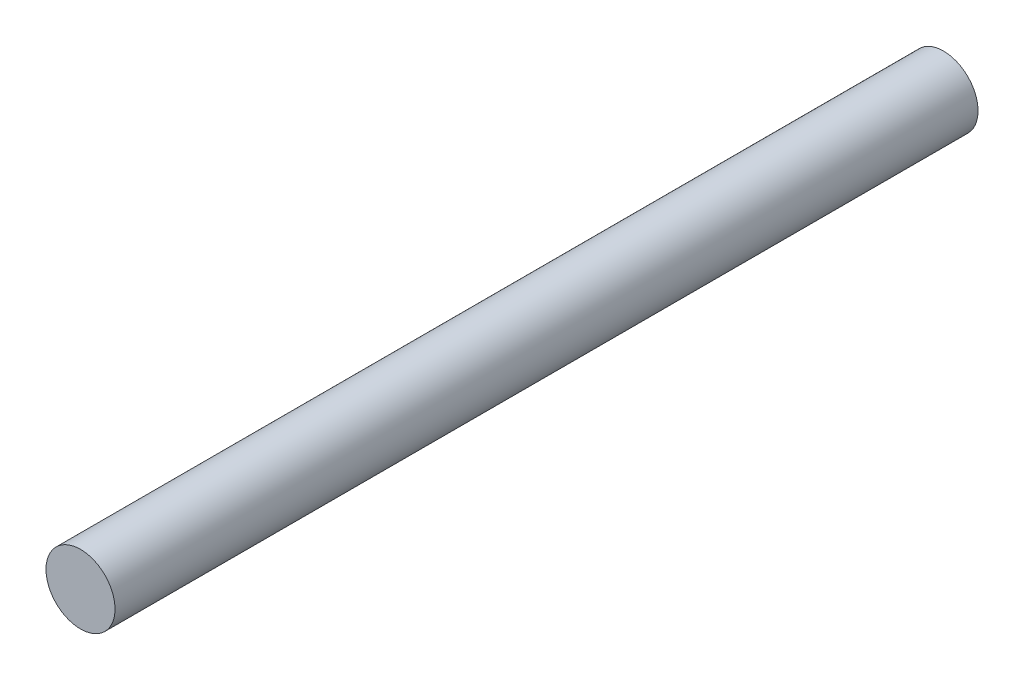
ISO-10303-21;
HEADER;
FILE_DESCRIPTION(('STEP AP214'),'2;1');
FILE_NAME('part.step','',(''),(''),'','','');
FILE_SCHEMA(('AUTOMOTIVE_DESIGN { 1 0 10303 214 1 1 1 1 }'));
ENDSEC;
DATA;
#1=APPLICATION_CONTEXT('core data for automotive mechanical design processes');
#2=APPLICATION_PROTOCOL_DEFINITION('international standard','automotive_design',2000,#1);
#3=PRODUCT_CONTEXT('',#1,'mechanical');
#4=PRODUCT('Part','Part','',(#3));
#5=PRODUCT_RELATED_PRODUCT_CATEGORY('part','',(#4));
#6=PRODUCT_DEFINITION_FORMATION('','',#4);
#7=PRODUCT_DEFINITION_CONTEXT('part definition',#1,'design');
#8=PRODUCT_DEFINITION('design','',#6,#7);
#9=PRODUCT_DEFINITION_SHAPE('','',#8);
#10=(LENGTH_UNIT() NAMED_UNIT(*) SI_UNIT(.MILLI.,.METRE.));
#11=(NAMED_UNIT(*) PLANE_ANGLE_UNIT() SI_UNIT($,.RADIAN.));
#12=(NAMED_UNIT(*) SI_UNIT($,.STERADIAN.) SOLID_ANGLE_UNIT());
#13=UNCERTAINTY_MEASURE_WITH_UNIT(LENGTH_MEASURE(1.E-05),#10,'distance_accuracy_value','');
#14=(GEOMETRIC_REPRESENTATION_CONTEXT(3) GLOBAL_UNCERTAINTY_ASSIGNED_CONTEXT((#13)) GLOBAL_UNIT_ASSIGNED_CONTEXT((#10,
#11,#12)) REPRESENTATION_CONTEXT('',''));
#15=CARTESIAN_POINT('',(0.,0.,0.));
#16=DIRECTION('',(0.,0.,1.));
#17=DIRECTION('',(1.,0.,0.));
#18=AXIS2_PLACEMENT_3D('',#15,#16,#17);
#19=CARTESIAN_POINT('',(0.,0.,50.));
#20=DIRECTION('',(0.,0.,-1.));
#21=DIRECTION('',(-1.,0.,0.));
#22=AXIS2_PLACEMENT_3D('',#19,#20,#21);
#23=CYLINDRICAL_SURFACE('',#22,4.);
#24=CARTESIAN_POINT('',(0.,0.,50.));
#25=DIRECTION('',(0.,0.,-1.));
#26=DIRECTION('',(-1.,0.,0.));
#27=AXIS2_PLACEMENT_3D('',#24,#25,#26);
#28=CIRCLE('',#27,4.);
#29=CARTESIAN_POINT('',(-3.99999999999999,0.,50.));
#30=VERTEX_POINT('',#29);
#31=EDGE_CURVE('E10',#30,#30,#28,.T.);
#32=ORIENTED_EDGE('',*,*,#31,.T.);
#33=EDGE_LOOP('',(#32));
#34=FACE_BOUND('',#33,.T.);
#35=CARTESIAN_POINT('',(0.,0.,-50.));
#36=DIRECTION('',(0.,0.,-1.));
#37=DIRECTION('',(-1.,0.,0.));
#38=AXIS2_PLACEMENT_3D('',#35,#36,#37);
#39=CIRCLE('',#38,4.);
#40=CARTESIAN_POINT('',(-3.99999999999999,0.,-50.));
#41=VERTEX_POINT('',#40);
#42=EDGE_CURVE('E36',#41,#41,#39,.T.);
#43=ORIENTED_EDGE('',*,*,#42,.F.);
#44=EDGE_LOOP('',(#43));
#45=FACE_BOUND('',#44,.T.);
#46=ADVANCED_FACE('F30',(#34,#45),#23,.T.);
#47=CARTESIAN_POINT('',(4.00000000000002,0.,50.));
#48=DIRECTION('',(0.,0.,1.));
#49=DIRECTION('',(1.,0.,0.));
#50=AXIS2_PLACEMENT_3D('',#47,#48,#49);
#51=PLANE('',#50);
#52=ORIENTED_EDGE('',*,*,#31,.F.);
#53=EDGE_LOOP('',(#52));
#54=FACE_BOUND('',#53,.T.);
#55=ADVANCED_FACE('F45',(#54),#51,.T.);
#56=CARTESIAN_POINT('',(0.,0.,-50.));
#57=DIRECTION('',(0.,0.,-1.));
#58=DIRECTION('',(-1.,0.,0.));
#59=AXIS2_PLACEMENT_3D('',#56,#57,#58);
#60=PLANE('',#59);
#61=ORIENTED_EDGE('',*,*,#42,.T.);
#62=EDGE_LOOP('',(#61));
#63=FACE_BOUND('',#62,.T.);
#64=ADVANCED_FACE('F42',(#63),#60,.T.);
#65=CLOSED_SHELL('',(#46,#55,#64));
#66=MANIFOLD_SOLID_BREP('B2',#65);
#67=ADVANCED_BREP_SHAPE_REPRESENTATION('',(#18,#66),#14);
#68=SHAPE_DEFINITION_REPRESENTATION(#9,#67);
ENDSEC;
END-ISO-10303-21;
